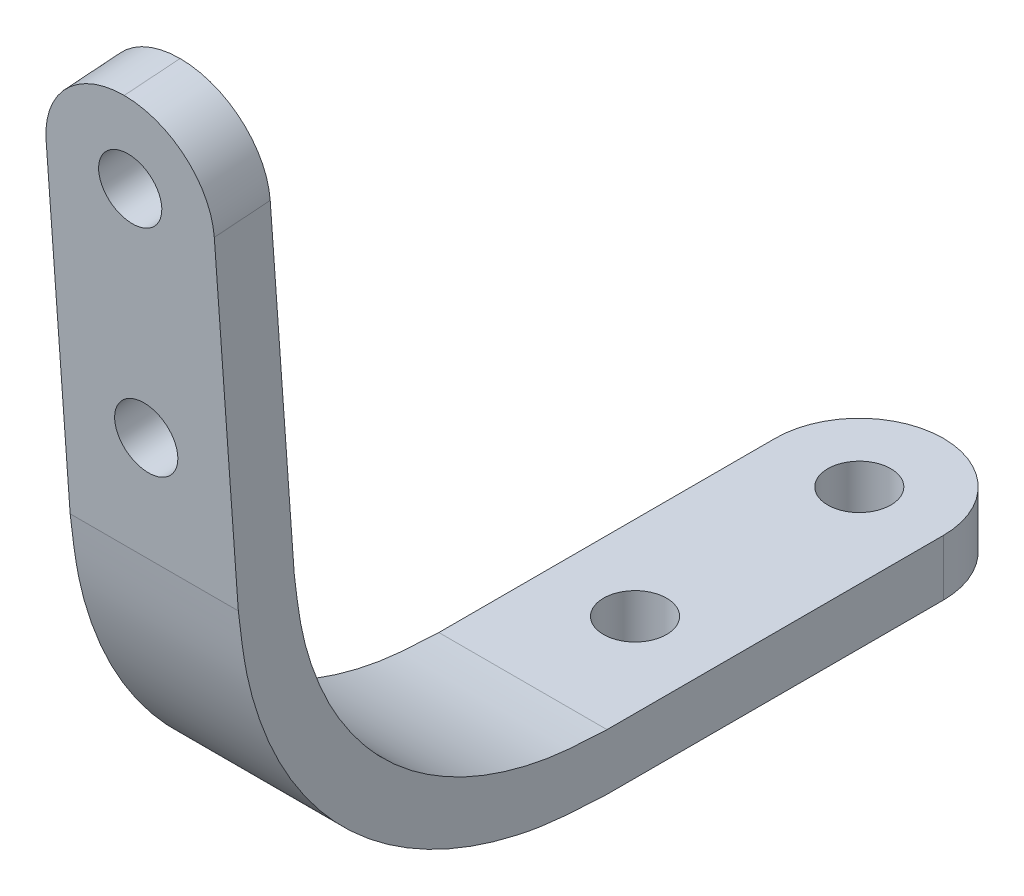
ISO-10303-21;
HEADER;
FILE_DESCRIPTION(('STEP AP214'),'2;1');
FILE_NAME('part.step','',(''),(''),'','','');
FILE_SCHEMA(('AUTOMOTIVE_DESIGN { 1 0 10303 214 1 1 1 1 }'));
ENDSEC;
DATA;
#1=APPLICATION_CONTEXT('core data for automotive mechanical design processes');
#2=APPLICATION_PROTOCOL_DEFINITION('international standard','automotive_design',2000,#1);
#3=PRODUCT_CONTEXT('',#1,'mechanical');
#4=PRODUCT('Part','Part','',(#3));
#5=PRODUCT_RELATED_PRODUCT_CATEGORY('part','',(#4));
#6=PRODUCT_DEFINITION_FORMATION('','',#4);
#7=PRODUCT_DEFINITION_CONTEXT('part definition',#1,'design');
#8=PRODUCT_DEFINITION('design','',#6,#7);
#9=PRODUCT_DEFINITION_SHAPE('','',#8);
#10=(LENGTH_UNIT() NAMED_UNIT(*) SI_UNIT(.MILLI.,.METRE.));
#11=(NAMED_UNIT(*) PLANE_ANGLE_UNIT() SI_UNIT($,.RADIAN.));
#12=(NAMED_UNIT(*) SI_UNIT($,.STERADIAN.) SOLID_ANGLE_UNIT());
#13=UNCERTAINTY_MEASURE_WITH_UNIT(LENGTH_MEASURE(1.E-05),#10,'distance_accuracy_value','');
#14=(GEOMETRIC_REPRESENTATION_CONTEXT(3) GLOBAL_UNCERTAINTY_ASSIGNED_CONTEXT((#13)) GLOBAL_UNIT_ASSIGNED_CONTEXT((#10,
#11,#12)) REPRESENTATION_CONTEXT('',''));
#15=CARTESIAN_POINT('',(0.,0.,0.));
#16=DIRECTION('',(0.,0.,1.));
#17=DIRECTION('',(1.,0.,0.));
#18=AXIS2_PLACEMENT_3D('',#15,#16,#17);
#19=CARTESIAN_POINT('',(9.52499999999997,153.371663551386,-8.11143140761639));
#20=DIRECTION('',(-1.,0.,0.));
#21=DIRECTION('',(0.,-1.,0.));
#22=AXIS2_PLACEMENT_3D('',#19,#20,#21);
#23=PLANE('',#22);
#24=DIRECTION('',(0.,-0.997443763229319,-0.0714558548681243));
#25=VECTOR('',#24,1.);
#26=CARTESIAN_POINT('',(9.52499999999997,153.371663551386,-8.11143140761639));
#27=LINE('',#26,#25);
#28=CARTESIAN_POINT('',(9.52499999999998,90.0339845863243,-12.6488781917423));
#29=VERTEX_POINT('',#28);
#30=CARTESIAN_POINT('',(9.52499999999999,52.0313772072872,-15.3713462622178));
#31=VERTEX_POINT('',#30);
#32=EDGE_CURVE('E917',#29,#31,#27,.T.);
#33=ORIENTED_EDGE('',*,*,#32,.F.);
#34=DIRECTION('',(0.,-0.0714558548681243,0.997443763229319));
#35=VECTOR('',#34,1.);
#36=CARTESIAN_POINT('',(9.52499999999998,90.0339845863243,-12.6488781917423));
#37=LINE('',#36,#35);
#38=CARTESIAN_POINT('',(9.52499999999998,89.5802399079117,-6.31511029523611));
#39=VERTEX_POINT('',#38);
#40=EDGE_CURVE('E13',#29,#39,#37,.T.);
#41=ORIENTED_EDGE('',*,*,#40,.T.);
#42=DIRECTION('',(0.,-0.997443763229319,-0.0714558548681243));
#43=VECTOR('',#42,1.);
#44=CARTESIAN_POINT('',(9.52499999999997,152.917918872973,-1.77766351111022));
#45=LINE('',#44,#43);
#46=CARTESIAN_POINT('',(9.52499999999999,51.5776325288746,-9.03757836571165));
#47=VERTEX_POINT('',#46);
#48=EDGE_CURVE('E933',#39,#47,#45,.T.);
#49=ORIENTED_EDGE('',*,*,#48,.T.);
#50=CARTESIAN_POINT('',(9.525,12.7,-50.8));
#51=CARTESIAN_POINT('',(9.52499999999999,12.8308882748088,-47.8775766786025));
#52=CARTESIAN_POINT('',(9.52499999999998,12.9680178897238,-44.815799103282));
#53=CARTESIAN_POINT('',(9.52500000000002,14.0795826437984,-39.058308853873));
#54=CARTESIAN_POINT('',(9.525,15.0045086451964,-35.9326922808977));
#55=CARTESIAN_POINT('',(9.525,17.2763267557502,-30.6281834819957));
#56=CARTESIAN_POINT('',(9.52499999999999,18.9550405356031,-27.6552517593565));
#57=CARTESIAN_POINT('',(9.52500000000001,22.2956456048244,-23.1021556507154));
#58=CARTESIAN_POINT('',(9.52499999999998,24.6362554487932,-20.5878684088171));
#59=CARTESIAN_POINT('',(9.52500000000001,28.9390069090945,-16.9304573711658));
#60=CARTESIAN_POINT('',(9.52499999999999,31.7843850945897,-15.0436014175862));
#61=CARTESIAN_POINT('',(9.525,36.9129978803806,-12.398553342071));
#62=CARTESIAN_POINT('',(9.52499999999996,39.9645297973123,-11.2526480208772));
#63=CARTESIAN_POINT('',(9.52500000000002,45.6278760286689,-9.73251655946219));
#64=CARTESIAN_POINT('',(9.52500000000001,48.672030222299,-9.37695595513388));
#65=CARTESIAN_POINT('',(9.52499999999999,51.5776325288746,-9.03757836571165));
#66=B_SPLINE_CURVE_WITH_KNOTS('',3,(#50,#51,#52,#53,#54,#55,#56,#57,#58,#59,#60,#61,#62,#63,#64,
#65),.UNSPECIFIED.,.F.,.F.,(4,1,1,1,1,1,1,1,1,1,1,1,1,4),(0.,0.14002984723678,0.146707098525374,
0.280001513089577,0.293357714059953,0.420004816091902,0.440027031922265,0.559972963766613,
0.579995179146985,0.706642278007628,0.719998478792354,0.853292801368042,0.859970045003551,1.),.UNSPECIFIED.);
#67=CARTESIAN_POINT('',(9.525,12.7,-50.8));
#68=VERTEX_POINT('',#67);
#69=EDGE_CURVE('E759',#68,#47,#66,.T.);
#70=ORIENTED_EDGE('',*,*,#69,.F.);
#71=DIRECTION('',(0.,0.,-1.));
#72=VECTOR('',#71,1.);
#73=CARTESIAN_POINT('',(9.525,12.7,0.));
#74=LINE('',#73,#72);
#75=CARTESIAN_POINT('',(9.525,12.7,-88.9));
#76=VERTEX_POINT('',#75);
#77=EDGE_CURVE('E738',#68,#76,#74,.T.);
#78=ORIENTED_EDGE('',*,*,#77,.T.);
#79=DIRECTION('',(0.,-1.,0.));
#80=VECTOR('',#79,1.);
#81=CARTESIAN_POINT('',(9.525,19.05,-88.9));
#82=LINE('',#81,#80);
#83=CARTESIAN_POINT('',(9.525,19.05,-88.9));
#84=VERTEX_POINT('',#83);
#85=EDGE_CURVE('E842',#76,#84,#82,.F.);
#86=ORIENTED_EDGE('',*,*,#85,.T.);
#87=DIRECTION('',(0.,0.,-1.));
#88=VECTOR('',#87,1.);
#89=CARTESIAN_POINT('',(9.525,19.05,0.));
#90=LINE('',#89,#88);
#91=CARTESIAN_POINT('',(9.525,19.05,-50.8));
#92=VERTEX_POINT('',#91);
#93=EDGE_CURVE('E737',#92,#84,#90,.T.);
#94=ORIENTED_EDGE('',*,*,#93,.F.);
#95=CARTESIAN_POINT('',(9.525,19.05,-50.8));
#96=CARTESIAN_POINT('',(9.525,19.164352680165,-48.2597212592029));
#97=CARTESIAN_POINT('',(9.52500000000001,19.2841582091051,-45.5983106323823));
#98=CARTESIAN_POINT('',(9.52499999999999,20.2385827079795,-40.6556094477857));
#99=CARTESIAN_POINT('',(9.525,21.0248239240138,-38.0053834579985));
#100=CARTESIAN_POINT('',(9.525,22.9396422864231,-33.5343931314013));
#101=CARTESIAN_POINT('',(9.525,24.3535138465138,-31.0320223661287));
#102=CARTESIAN_POINT('',(9.52499999999999,27.1498113937403,-27.2213574601229));
#103=CARTESIAN_POINT('',(9.525,29.0917861926064,-25.1352846926192));
#104=CARTESIAN_POINT('',(9.52499999999999,32.692898237172,-22.0738408589274));
#105=CARTESIAN_POINT('',(9.52499999999999,35.0878428901997,-20.4847744600066));
#106=CARTESIAN_POINT('',(9.525,39.4105777776866,-18.2553732148253));
#107=CARTESIAN_POINT('',(9.52499999999998,41.9978464754054,-17.2817669629771));
#108=CARTESIAN_POINT('',(9.52500000000001,46.8597120958185,-15.9765965029822));
#109=CARTESIAN_POINT('',(9.525,49.505760894048,-15.6669241561299));
#110=CARTESIAN_POINT('',(9.52499999999999,52.0313772072872,-15.3713462622178));
#111=B_SPLINE_CURVE_WITH_KNOTS('',3,(#95,#96,#97,#98,#99,#100,#101,#102,#103,#104,#105,#106,
#107,#108,#109,#110),.UNSPECIFIED.,.F.,.F.,(4,1,1,1,1,1,1,1,1,1,1,1,1,4),(0.,0.14002984723678,
0.146707098525374,0.280001513089577,0.293357714059953,0.420004816091902,0.440027031922265,
0.559972963766613,0.579995179146985,0.706642278007628,0.719998478792354,0.853292801368042,
0.859970045003551,1.),.UNSPECIFIED.);
#112=EDGE_CURVE('E747',#31,#92,#111,.F.);
#113=ORIENTED_EDGE('',*,*,#112,.F.);
#114=EDGE_LOOP('',(#33,#41,#49,#70,#78,#86,#94,#113));
#115=FACE_BOUND('',#114,.T.);
#116=ADVANCED_FACE('F649',(#115),#23,.F.);
#117=CARTESIAN_POINT('',(-9.52500000000001,1.36123403523777,-19.0013036895185));
#118=DIRECTION('',(1.,0.,0.));
#119=DIRECTION('',(0.,1.,0.));
#120=AXIS2_PLACEMENT_3D('',#117,#118,#119);
#121=PLANE('',#120);
#122=DIRECTION('',(0.,0.997443763229319,0.0714558548681243));
#123=VECTOR('',#122,1.);
#124=CARTESIAN_POINT('',(-9.52500000000001,0.907489356825177,-12.6675357930124));
#125=LINE('',#124,#123);
#126=CARTESIAN_POINT('',(-9.52500000000002,51.5776325288746,-9.03757836571164));
#127=VERTEX_POINT('',#126);
#128=CARTESIAN_POINT('',(-9.52500000000003,89.5802399079117,-6.31511029523611));
#129=VERTEX_POINT('',#128);
#130=EDGE_CURVE('E913',#127,#129,#125,.T.);
#131=ORIENTED_EDGE('',*,*,#130,.T.);
#132=DIRECTION('',(0.,-0.0714558548681243,0.997443763229319));
#133=VECTOR('',#132,1.);
#134=CARTESIAN_POINT('',(-9.52500000000003,90.0339845863243,-12.6488781917423));
#135=LINE('',#134,#133);
#136=CARTESIAN_POINT('',(-9.52500000000003,90.0339845863243,-12.6488781917423));
#137=VERTEX_POINT('',#136);
#138=EDGE_CURVE('E915',#129,#137,#135,.F.);
#139=ORIENTED_EDGE('',*,*,#138,.T.);
#140=DIRECTION('',(0.,0.997443763229319,0.0714558548681243));
#141=VECTOR('',#140,1.);
#142=CARTESIAN_POINT('',(-9.52500000000001,1.36123403523777,-19.0013036895185));
#143=LINE('',#142,#141);
#144=CARTESIAN_POINT('',(-9.52500000000002,52.0313772072872,-15.3713462622178));
#145=VERTEX_POINT('',#144);
#146=EDGE_CURVE('E755',#145,#137,#143,.T.);
#147=ORIENTED_EDGE('',*,*,#146,.F.);
#148=CARTESIAN_POINT('',(-9.525,19.05,-50.8));
#149=CARTESIAN_POINT('',(-9.52500000000001,19.164352680165,-48.2597212592029));
#150=CARTESIAN_POINT('',(-9.52500000000002,19.2841582091051,-45.5983106323823));
#151=CARTESIAN_POINT('',(-9.52499999999999,20.2385827079795,-40.6556094477857));
#152=CARTESIAN_POINT('',(-9.52500000000001,21.0248239240138,-38.0053834579985));
#153=CARTESIAN_POINT('',(-9.525,22.9396422864231,-33.5343931314013));
#154=CARTESIAN_POINT('',(-9.525,24.3535138465138,-31.0320223661287));
#155=CARTESIAN_POINT('',(-9.52500000000001,27.1498113937403,-27.2213574601229));
#156=CARTESIAN_POINT('',(-9.52500000000002,29.0917861926064,-25.1352846926192));
#157=CARTESIAN_POINT('',(-9.52500000000001,32.692898237172,-22.0738408589274));
#158=CARTESIAN_POINT('',(-9.52500000000001,35.0878428901997,-20.4847744600066));
#159=CARTESIAN_POINT('',(-9.52500000000003,39.4105777776866,-18.2553732148253));
#160=CARTESIAN_POINT('',(-9.52500000000001,41.9978464754054,-17.281766962977));
#161=CARTESIAN_POINT('',(-9.52500000000004,46.8597120958185,-15.9765965029822));
#162=CARTESIAN_POINT('',(-9.52500000000003,49.505760894048,-15.6669241561299));
#163=CARTESIAN_POINT('',(-9.52500000000002,52.0313772072872,-15.3713462622178));
#164=B_SPLINE_CURVE_WITH_KNOTS('',3,(#148,#149,#150,#151,#152,#153,#154,#155,#156,#157,#158,
#159,#160,#161,#162,#163),.UNSPECIFIED.,.F.,.F.,(4,1,1,1,1,1,1,1,1,1,1,1,1,4),(0.,
0.14002984723678,0.146707098525374,0.280001513089577,0.293357714059953,0.420004816091902,
0.440027031922265,0.559972963766613,0.579995179146985,0.706642278007628,0.719998478792354,
0.853292801368042,0.859970045003551,1.),.UNSPECIFIED.);
#165=CARTESIAN_POINT('',(-9.525,19.05,-50.8));
#166=VERTEX_POINT('',#165);
#167=EDGE_CURVE('E745',#166,#145,#164,.T.);
#168=ORIENTED_EDGE('',*,*,#167,.F.);
#169=DIRECTION('',(0.,0.,1.));
#170=VECTOR('',#169,1.);
#171=CARTESIAN_POINT('',(-9.525,19.05,-152.4));
#172=LINE('',#171,#170);
#173=CARTESIAN_POINT('',(-9.525,19.05,-88.9));
#174=VERTEX_POINT('',#173);
#175=EDGE_CURVE('E725',#174,#166,#172,.T.);
#176=ORIENTED_EDGE('',*,*,#175,.F.);
#177=DIRECTION('',(0.,-1.,0.));
#178=VECTOR('',#177,1.);
#179=CARTESIAN_POINT('',(-9.525,19.05,-88.9));
#180=LINE('',#179,#178);
#181=CARTESIAN_POINT('',(-9.525,12.7,-88.9));
#182=VERTEX_POINT('',#181);
#183=EDGE_CURVE('E897',#174,#182,#180,.T.);
#184=ORIENTED_EDGE('',*,*,#183,.T.);
#185=DIRECTION('',(0.,0.,1.));
#186=VECTOR('',#185,1.);
#187=CARTESIAN_POINT('',(-9.525,12.7,-152.4));
#188=LINE('',#187,#186);
#189=CARTESIAN_POINT('',(-9.525,12.7,-50.8));
#190=VERTEX_POINT('',#189);
#191=EDGE_CURVE('E874',#182,#190,#188,.T.);
#192=ORIENTED_EDGE('',*,*,#191,.T.);
#193=CARTESIAN_POINT('',(-9.525,12.7,-50.8));
#194=CARTESIAN_POINT('',(-9.52500000000001,12.8308882748088,-47.8775766786025));
#195=CARTESIAN_POINT('',(-9.52500000000001,12.9680178897238,-44.815799103282));
#196=CARTESIAN_POINT('',(-9.52499999999999,14.0795826437984,-39.058308853873));
#197=CARTESIAN_POINT('',(-9.52500000000001,15.0045086451964,-35.9326922808976));
#198=CARTESIAN_POINT('',(-9.525,17.2763267557502,-30.6281834819958));
#199=CARTESIAN_POINT('',(-9.525,18.9550405356031,-27.6552517593565));
#200=CARTESIAN_POINT('',(-9.52500000000001,22.2956456048244,-23.1021556507154));
#201=CARTESIAN_POINT('',(-9.52500000000001,24.6362554487932,-20.5878684088171));
#202=CARTESIAN_POINT('',(-9.52500000000001,28.9390069090945,-16.9304573711658));
#203=CARTESIAN_POINT('',(-9.525,31.7843850945897,-15.0436014175862));
#204=CARTESIAN_POINT('',(-9.52500000000003,36.9129978803806,-12.398553342071));
#205=CARTESIAN_POINT('',(-9.52499999999999,39.9645297973123,-11.2526480208772));
#206=CARTESIAN_POINT('',(-9.52500000000005,45.6278760286689,-9.73251655946217));
#207=CARTESIAN_POINT('',(-9.52500000000004,48.672030222299,-9.37695595513387));
#208=CARTESIAN_POINT('',(-9.52500000000002,51.5776325288746,-9.03757836571164));
#209=B_SPLINE_CURVE_WITH_KNOTS('',3,(#193,#194,#195,#196,#197,#198,#199,#200,#201,#202,#203,
#204,#205,#206,#207,#208),.UNSPECIFIED.,.F.,.F.,(4,1,1,1,1,1,1,1,1,1,1,1,1,4),(0.,
0.14002984723678,0.146707098525374,0.280001513089577,0.293357714059953,0.420004816091902,
0.440027031922265,0.559972963766613,0.579995179146985,0.706642278007628,0.719998478792354,
0.853292801368042,0.859970045003551,1.),.UNSPECIFIED.);
#210=EDGE_CURVE('E756',#190,#127,#209,.T.);
#211=ORIENTED_EDGE('',*,*,#210,.T.);
#212=EDGE_LOOP('',(#131,#139,#147,#168,#176,#184,#192,#211));
#213=FACE_BOUND('',#212,.T.);
#214=ADVANCED_FACE('F753',(#213),#121,.F.);
#215=CARTESIAN_POINT('',(0.,1.36123403523777,-19.0013036895185));
#216=DIRECTION('',(0.,0.0714558548681243,-0.997443763229319));
#217=DIRECTION('',(0.,0.997443763229319,0.0714558548681243));
#218=AXIS2_PLACEMENT_3D('',#215,#216,#217);
#219=PLANE('',#218);
#220=CARTESIAN_POINT('',(0.,90.0339845863243,-12.6488781917423));
#221=DIRECTION('',(0.,0.0714558548681243,-0.997443763229319));
#222=DIRECTION('',(0.,0.997443763229319,0.0714558548681243));
#223=AXIS2_PLACEMENT_3D('',#220,#221,#222);
#224=CIRCLE('',#223,3.57124);
#225=CARTESIAN_POINT('',(0.,93.5960956513193,-12.393692184603));
#226=VERTEX_POINT('',#225);
#227=EDGE_CURVE('E941',#226,#226,#224,.T.);
#228=ORIENTED_EDGE('',*,*,#227,.F.);
#229=EDGE_LOOP('',(#228));
#230=FACE_BOUND('',#229,.T.);
#231=CARTESIAN_POINT('',(0.,64.6989130002996,-14.4638569053926));
#232=DIRECTION('',(0.,0.0714558548681243,-0.997443763229319));
#233=DIRECTION('',(0.,0.997443763229319,0.0714558548681243));
#234=AXIS2_PLACEMENT_3D('',#231,#232,#233);
#235=CIRCLE('',#234,3.57124);
#236=CARTESIAN_POINT('',(0.,68.2610240652946,-14.2086708982534));
#237=VERTEX_POINT('',#236);
#238=EDGE_CURVE('E937',#237,#237,#235,.T.);
#239=ORIENTED_EDGE('',*,*,#238,.F.);
#240=EDGE_LOOP('',(#239));
#241=FACE_BOUND('',#240,.T.);
#242=ORIENTED_EDGE('',*,*,#146,.T.);
#243=CARTESIAN_POINT('',(0.,90.0339845863243,-12.6488781917423));
#244=DIRECTION('',(0.,0.0714558548681243,-0.997443763229319));
#245=DIRECTION('',(0.,0.997443763229319,0.0714558548681243));
#246=AXIS2_PLACEMENT_3D('',#243,#244,#245);
#247=CIRCLE('',#246,9.525);
#248=CARTESIAN_POINT('',(0.,99.5346364310835,-11.9682611741234));
#249=VERTEX_POINT('',#248);
#250=EDGE_CURVE('E659',#137,#249,#247,.T.);
#251=ORIENTED_EDGE('',*,*,#250,.T.);
#252=CARTESIAN_POINT('',(0.,90.0339845863243,-12.6488781917423));
#253=DIRECTION('',(0.,0.0714558548681243,-0.997443763229319));
#254=DIRECTION('',(0.,0.997443763229319,0.0714558548681243));
#255=AXIS2_PLACEMENT_3D('',#252,#253,#254);
#256=CIRCLE('',#255,9.525);
#257=EDGE_CURVE('E670',#249,#29,#256,.T.);
#258=ORIENTED_EDGE('',*,*,#257,.T.);
#259=ORIENTED_EDGE('',*,*,#32,.T.);
#260=CARTESIAN_POINT('',(-9.52500000000002,52.0313772072872,-15.3713462622178));
#261=CARTESIAN_POINT('',(9.52499999999999,52.0313772072872,-15.3713462622178));
#262=B_SPLINE_CURVE_WITH_KNOTS('',1,(#260,#261),.UNSPECIFIED.,.F.,.F.,(2,2),(0.,1.),.UNSPECIFIED.);
#263=EDGE_CURVE('E828',#31,#145,#262,.F.);
#264=ORIENTED_EDGE('',*,*,#263,.T.);
#265=EDGE_LOOP('',(#242,#251,#258,#259,#264));
#266=FACE_BOUND('',#265,.T.);
#267=ADVANCED_FACE('F955',(#230,#241,#266),#219,.T.);
#268=CARTESIAN_POINT('',(0.,0.907489356825179,-12.6675357930124));
#269=DIRECTION('',(0.,0.0714558548681243,-0.997443763229319));
#270=DIRECTION('',(0.,0.997443763229319,0.0714558548681243));
#271=AXIS2_PLACEMENT_3D('',#268,#269,#270);
#272=PLANE('',#271);
#273=CARTESIAN_POINT('',(0.,89.5802399079117,-6.31511029523611));
#274=DIRECTION('',(0.,0.0714558548681243,-0.997443763229319));
#275=DIRECTION('',(0.,0.997443763229319,0.0714558548681243));
#276=AXIS2_PLACEMENT_3D('',#273,#274,#275);
#277=CIRCLE('',#276,3.57124);
#278=CARTESIAN_POINT('',(0.,93.1423509729068,-6.05992428809687));
#279=VERTEX_POINT('',#278);
#280=EDGE_CURVE('E938',#279,#279,#277,.T.);
#281=ORIENTED_EDGE('',*,*,#280,.T.);
#282=EDGE_LOOP('',(#281));
#283=FACE_BOUND('',#282,.T.);
#284=CARTESIAN_POINT('',(0.,64.245168321887,-8.13008900888646));
#285=DIRECTION('',(0.,0.0714558548681243,-0.997443763229319));
#286=DIRECTION('',(0.,0.997443763229319,0.0714558548681243));
#287=AXIS2_PLACEMENT_3D('',#284,#285,#286);
#288=CIRCLE('',#287,3.57124);
#289=CARTESIAN_POINT('',(0.,67.8072793868821,-7.87490300174722));
#290=VERTEX_POINT('',#289);
#291=EDGE_CURVE('E934',#290,#290,#288,.T.);
#292=ORIENTED_EDGE('',*,*,#291,.T.);
#293=EDGE_LOOP('',(#292));
#294=FACE_BOUND('',#293,.T.);
#295=CARTESIAN_POINT('',(0.,89.5802399079117,-6.31511029523611));
#296=DIRECTION('',(0.,0.0714558548681243,-0.997443763229319));
#297=DIRECTION('',(0.,0.997443763229319,0.0714558548681243));
#298=AXIS2_PLACEMENT_3D('',#295,#296,#297);
#299=CIRCLE('',#298,9.525);
#300=CARTESIAN_POINT('',(0.,99.080891752671,-5.63449327761722));
#301=VERTEX_POINT('',#300);
#302=EDGE_CURVE('E926',#39,#301,#299,.F.);
#303=ORIENTED_EDGE('',*,*,#302,.T.);
#304=CARTESIAN_POINT('',(0.,89.5802399079117,-6.31511029523611));
#305=DIRECTION('',(0.,0.0714558548681243,-0.997443763229319));
#306=DIRECTION('',(0.,0.997443763229319,0.0714558548681243));
#307=AXIS2_PLACEMENT_3D('',#304,#305,#306);
#308=CIRCLE('',#307,9.525);
#309=EDGE_CURVE('E923',#301,#129,#308,.F.);
#310=ORIENTED_EDGE('',*,*,#309,.T.);
#311=ORIENTED_EDGE('',*,*,#130,.F.);
#312=CARTESIAN_POINT('',(9.52499999999999,51.5776325288746,-9.03757836571165));
#313=CARTESIAN_POINT('',(-9.52500000000002,51.5776325288746,-9.03757836571164));
#314=B_SPLINE_CURVE_WITH_KNOTS('',1,(#312,#313),.UNSPECIFIED.,.F.,.F.,(2,2),(0.,1.),.UNSPECIFIED.);
#315=EDGE_CURVE('E912',#47,#127,#314,.T.);
#316=ORIENTED_EDGE('',*,*,#315,.F.);
#317=ORIENTED_EDGE('',*,*,#48,.F.);
#318=EDGE_LOOP('',(#303,#310,#311,#316,#317));
#319=FACE_BOUND('',#318,.T.);
#320=ADVANCED_FACE('F964',(#283,#294,#319),#272,.F.);
#321=CARTESIAN_POINT('',(0.,90.0339845863243,-12.6488781917423));
#322=DIRECTION('',(0.,-0.0714558548681243,0.997443763229319));
#323=DIRECTION('',(0.,-0.997443763229319,-0.0714558548681243));
#324=AXIS2_PLACEMENT_3D('',#321,#322,#323);
#325=CYLINDRICAL_SURFACE('',#324,9.525);
#326=ORIENTED_EDGE('',*,*,#40,.F.);
#327=ORIENTED_EDGE('',*,*,#257,.F.);
#328=DIRECTION('',(0.,-0.0714558548681243,0.997443763229319));
#329=VECTOR('',#328,1.);
#330=CARTESIAN_POINT('',(0.,99.5346364310835,-11.9682611741234));
#331=LINE('',#330,#329);
#332=EDGE_CURVE('E931',#301,#249,#331,.F.);
#333=ORIENTED_EDGE('',*,*,#332,.F.);
#334=ORIENTED_EDGE('',*,*,#302,.F.);
#335=EDGE_LOOP('',(#326,#327,#333,#334));
#336=FACE_BOUND('',#335,.T.);
#337=ADVANCED_FACE('F651',(#336),#325,.T.);
#338=CARTESIAN_POINT('',(0.,90.0339845863243,-12.6488781917423));
#339=DIRECTION('',(0.,-0.0714558548681243,0.997443763229319));
#340=DIRECTION('',(0.,-0.997443763229319,-0.0714558548681243));
#341=AXIS2_PLACEMENT_3D('',#338,#339,#340);
#342=CYLINDRICAL_SURFACE('',#341,9.525);
#343=ORIENTED_EDGE('',*,*,#250,.F.);
#344=ORIENTED_EDGE('',*,*,#138,.F.);
#345=ORIENTED_EDGE('',*,*,#309,.F.);
#346=ORIENTED_EDGE('',*,*,#332,.T.);
#347=EDGE_LOOP('',(#343,#344,#345,#346));
#348=FACE_BOUND('',#347,.T.);
#349=ADVANCED_FACE('F921',(#348),#342,.T.);
#350=CARTESIAN_POINT('',(0.,64.6989130002996,-14.4638569053926));
#351=DIRECTION('',(0.,0.0714558548681243,-0.997443763229319));
#352=DIRECTION('',(0.,0.997443763229319,0.0714558548681243));
#353=AXIS2_PLACEMENT_3D('',#350,#351,#352);
#354=CYLINDRICAL_SURFACE('',#353,3.57124);
#355=ORIENTED_EDGE('',*,*,#238,.T.);
#356=EDGE_LOOP('',(#355));
#357=FACE_BOUND('',#356,.T.);
#358=ORIENTED_EDGE('',*,*,#291,.F.);
#359=EDGE_LOOP('',(#358));
#360=FACE_BOUND('',#359,.T.);
#361=ADVANCED_FACE('F966',(#357,#360),#354,.F.);
#362=CARTESIAN_POINT('',(0.,90.0339845863243,-12.6488781917423));
#363=DIRECTION('',(0.,0.0714558548681243,-0.997443763229319));
#364=DIRECTION('',(0.,0.997443763229319,0.0714558548681243));
#365=AXIS2_PLACEMENT_3D('',#362,#363,#364);
#366=CYLINDRICAL_SURFACE('',#365,3.57124);
#367=ORIENTED_EDGE('',*,*,#227,.T.);
#368=EDGE_LOOP('',(#367));
#369=FACE_BOUND('',#368,.T.);
#370=ORIENTED_EDGE('',*,*,#280,.F.);
#371=EDGE_LOOP('',(#370));
#372=FACE_BOUND('',#371,.T.);
#373=ADVANCED_FACE('F808',(#369,#372),#366,.F.);
#374=CARTESIAN_POINT('',(9.525,19.05,-50.8));
#375=CARTESIAN_POINT('',(9.525,19.164352680165,-48.2597212592029));
#376=CARTESIAN_POINT('',(9.52500000000001,19.2841582091051,-45.5983106323823));
#377=CARTESIAN_POINT('',(9.52499999999999,20.2385827079795,-40.6556094477857));
#378=CARTESIAN_POINT('',(9.525,21.0248239240138,-38.0053834579985));
#379=CARTESIAN_POINT('',(9.525,22.9396422864231,-33.5343931314013));
#380=CARTESIAN_POINT('',(9.525,24.3535138465138,-31.0320223661287));
#381=CARTESIAN_POINT('',(9.52499999999999,27.1498113937403,-27.2213574601229));
#382=CARTESIAN_POINT('',(9.525,29.0917861926064,-25.1352846926192));
#383=CARTESIAN_POINT('',(9.52499999999999,32.692898237172,-22.0738408589274));
#384=CARTESIAN_POINT('',(9.52499999999999,35.0878428901997,-20.4847744600066));
#385=CARTESIAN_POINT('',(9.525,39.4105777776866,-18.2553732148253));
#386=CARTESIAN_POINT('',(9.52499999999998,41.9978464754054,-17.2817669629771));
#387=CARTESIAN_POINT('',(9.52500000000001,46.8597120958185,-15.9765965029822));
#388=CARTESIAN_POINT('',(9.525,49.505760894048,-15.6669241561299));
#389=CARTESIAN_POINT('',(9.52499999999999,52.0313772072872,-15.3713462622178));
#390=CARTESIAN_POINT('',(-9.525,19.05,-50.8));
#391=CARTESIAN_POINT('',(-9.52500000000001,19.164352680165,-48.2597212592029));
#392=CARTESIAN_POINT('',(-9.52500000000002,19.2841582091051,-45.5983106323823));
#393=CARTESIAN_POINT('',(-9.52499999999999,20.2385827079795,-40.6556094477857));
#394=CARTESIAN_POINT('',(-9.52500000000001,21.0248239240138,-38.0053834579985));
#395=CARTESIAN_POINT('',(-9.525,22.9396422864231,-33.5343931314013));
#396=CARTESIAN_POINT('',(-9.525,24.3535138465138,-31.0320223661287));
#397=CARTESIAN_POINT('',(-9.52500000000001,27.1498113937403,-27.2213574601229));
#398=CARTESIAN_POINT('',(-9.52500000000002,29.0917861926064,-25.1352846926192));
#399=CARTESIAN_POINT('',(-9.52500000000001,32.692898237172,-22.0738408589274));
#400=CARTESIAN_POINT('',(-9.52500000000001,35.0878428901997,-20.4847744600066));
#401=CARTESIAN_POINT('',(-9.52500000000003,39.4105777776866,-18.2553732148253));
#402=CARTESIAN_POINT('',(-9.52500000000001,41.9978464754054,-17.281766962977));
#403=CARTESIAN_POINT('',(-9.52500000000004,46.8597120958185,-15.9765965029822));
#404=CARTESIAN_POINT('',(-9.52500000000003,49.505760894048,-15.6669241561299));
#405=CARTESIAN_POINT('',(-9.52500000000002,52.0313772072872,-15.3713462622178));
#406=B_SPLINE_SURFACE_WITH_KNOTS('',1,3,((#374,#375,#376,#377,#378,#379,#380,#381,#382,#383,
#384,#385,#386,#387,#388,#389),(#390,#391,#392,#393,#394,#395,#396,#397,#398,#399,#400,#401,
#402,#403,#404,#405)),.UNSPECIFIED.,.F.,.F.,.F.,(2,2),(4,1,1,1,1,1,1,1,1,1,1,1,1,4),(0.,1.),(0.,
0.14002984723678,0.146707098525374,0.280001513089577,0.293357714059953,0.420004816091902,
0.440027031922265,0.559972963766613,0.579995179146985,0.706642278007628,0.719998478792354,
0.853292801368042,0.859970045003551,1.),.UNSPECIFIED.);
#407=DIRECTION('',(-1.,0.,0.));
#408=VECTOR('',#407,1.);
#409=CARTESIAN_POINT('',(9.525,19.05,-50.8));
#410=LINE('',#409,#408);
#411=EDGE_CURVE('E653',#92,#166,#410,.T.);
#412=ORIENTED_EDGE('',*,*,#411,.T.);
#413=ORIENTED_EDGE('',*,*,#167,.T.);
#414=ORIENTED_EDGE('',*,*,#263,.F.);
#415=ORIENTED_EDGE('',*,*,#112,.T.);
#416=EDGE_LOOP('',(#412,#413,#414,#415));
#417=FACE_BOUND('',#416,.T.);
#418=ADVANCED_FACE('F743',(#417),#406,.T.);
#419=CARTESIAN_POINT('',(-9.525,12.7,-50.8));
#420=CARTESIAN_POINT('',(-9.52500000000001,12.8308882748088,-47.8775766786025));
#421=CARTESIAN_POINT('',(-9.52500000000001,12.9680178897238,-44.8157991032821));
#422=CARTESIAN_POINT('',(-9.52499999999999,14.0795826437984,-39.058308853873));
#423=CARTESIAN_POINT('',(-9.52500000000001,15.0045086451964,-35.9326922808976));
#424=CARTESIAN_POINT('',(-9.525,17.2763267557502,-30.6281834819958));
#425=CARTESIAN_POINT('',(-9.52500000000001,18.9550405356031,-27.6552517593565));
#426=CARTESIAN_POINT('',(-9.52500000000001,22.2956456048244,-23.1021556507154));
#427=CARTESIAN_POINT('',(-9.52500000000001,24.6362554487932,-20.5878684088171));
#428=CARTESIAN_POINT('',(-9.52500000000001,28.9390069090945,-16.9304573711658));
#429=CARTESIAN_POINT('',(-9.525,31.7843850945897,-15.0436014175862));
#430=CARTESIAN_POINT('',(-9.52500000000003,36.9129978803806,-12.398553342071));
#431=CARTESIAN_POINT('',(-9.52499999999999,39.9645297973123,-11.2526480208772));
#432=CARTESIAN_POINT('',(-9.52500000000005,45.6278760286689,-9.73251655946217));
#433=CARTESIAN_POINT('',(-9.52500000000004,48.672030222299,-9.37695595513387));
#434=CARTESIAN_POINT('',(-9.52500000000002,51.5776325288746,-9.03757836571164));
#435=CARTESIAN_POINT('',(9.525,12.7,-50.8));
#436=CARTESIAN_POINT('',(9.52499999999999,12.8308882748088,-47.8775766786025));
#437=CARTESIAN_POINT('',(9.52499999999998,12.9680178897238,-44.815799103282));
#438=CARTESIAN_POINT('',(9.52500000000002,14.0795826437984,-39.058308853873));
#439=CARTESIAN_POINT('',(9.525,15.0045086451964,-35.9326922808977));
#440=CARTESIAN_POINT('',(9.525,17.2763267557502,-30.6281834819957));
#441=CARTESIAN_POINT('',(9.52499999999999,18.9550405356031,-27.6552517593565));
#442=CARTESIAN_POINT('',(9.52500000000001,22.2956456048244,-23.1021556507154));
#443=CARTESIAN_POINT('',(9.52499999999998,24.6362554487932,-20.5878684088171));
#444=CARTESIAN_POINT('',(9.52500000000001,28.9390069090945,-16.9304573711658));
#445=CARTESIAN_POINT('',(9.52499999999999,31.7843850945897,-15.0436014175862));
#446=CARTESIAN_POINT('',(9.525,36.9129978803806,-12.398553342071));
#447=CARTESIAN_POINT('',(9.52499999999996,39.9645297973123,-11.2526480208772));
#448=CARTESIAN_POINT('',(9.52500000000002,45.6278760286689,-9.73251655946219));
#449=CARTESIAN_POINT('',(9.52500000000001,48.672030222299,-9.37695595513388));
#450=CARTESIAN_POINT('',(9.52499999999999,51.5776325288746,-9.03757836571165));
#451=B_SPLINE_SURFACE_WITH_KNOTS('',1,3,((#419,#420,#421,#422,#423,#424,#425,#426,#427,#428,
#429,#430,#431,#432,#433,#434),(#435,#436,#437,#438,#439,#440,#441,#442,#443,#444,#445,#446,
#447,#448,#449,#450)),.UNSPECIFIED.,.F.,.F.,.F.,(2,2),(4,1,1,1,1,1,1,1,1,1,1,1,1,4),(0.,1.),(0.,
0.14002984723678,0.146707098525374,0.280001513089577,0.293357714059953,0.420004816091902,
0.440027031922265,0.559972963766613,0.579995179146985,0.706642278007628,0.719998478792354,
0.853292801368042,0.859970045003551,1.),.UNSPECIFIED.);
#452=DIRECTION('',(1.,0.,0.));
#453=VECTOR('',#452,1.);
#454=CARTESIAN_POINT('',(-9.525,12.7,-50.8));
#455=LINE('',#454,#453);
#456=EDGE_CURVE('E748',#190,#68,#455,.T.);
#457=ORIENTED_EDGE('',*,*,#456,.T.);
#458=ORIENTED_EDGE('',*,*,#69,.T.);
#459=ORIENTED_EDGE('',*,*,#315,.T.);
#460=ORIENTED_EDGE('',*,*,#210,.F.);
#461=EDGE_LOOP('',(#457,#458,#459,#460));
#462=FACE_BOUND('',#461,.T.);
#463=ADVANCED_FACE('F792',(#462),#451,.T.);
#464=CARTESIAN_POINT('',(0.,19.05,0.));
#465=DIRECTION('',(0.,1.,0.));
#466=DIRECTION('',(0.,0.,1.));
#467=AXIS2_PLACEMENT_3D('',#464,#465,#466);
#468=PLANE('',#467);
#469=CARTESIAN_POINT('',(0.,19.05,-88.9));
#470=DIRECTION('',(0.,1.,0.));
#471=DIRECTION('',(0.,0.,1.));
#472=AXIS2_PLACEMENT_3D('',#469,#470,#471);
#473=CIRCLE('',#472,3.57123999999999);
#474=CARTESIAN_POINT('',(0.,19.05,-85.32876));
#475=VERTEX_POINT('',#474);
#476=EDGE_CURVE('E1132',#475,#475,#473,.T.);
#477=ORIENTED_EDGE('',*,*,#476,.F.);
#478=EDGE_LOOP('',(#477));
#479=FACE_BOUND('',#478,.T.);
#480=CARTESIAN_POINT('',(0.,19.05,-63.5));
#481=DIRECTION('',(0.,1.,0.));
#482=DIRECTION('',(0.,0.,1.));
#483=AXIS2_PLACEMENT_3D('',#480,#481,#482);
#484=CIRCLE('',#483,3.57123999999999);
#485=CARTESIAN_POINT('',(0.,19.05,-59.92876));
#486=VERTEX_POINT('',#485);
#487=EDGE_CURVE('E888',#486,#486,#484,.T.);
#488=ORIENTED_EDGE('',*,*,#487,.F.);
#489=EDGE_LOOP('',(#488));
#490=FACE_BOUND('',#489,.T.);
#491=CARTESIAN_POINT('',(0.,19.05,-88.9));
#492=DIRECTION('',(0.,1.,0.));
#493=DIRECTION('',(0.,0.,1.));
#494=AXIS2_PLACEMENT_3D('',#491,#492,#493);
#495=CIRCLE('',#494,9.525);
#496=CARTESIAN_POINT('',(0.,19.05,-98.425));
#497=VERTEX_POINT('',#496);
#498=EDGE_CURVE('E903',#84,#497,#495,.T.);
#499=ORIENTED_EDGE('',*,*,#498,.T.);
#500=CARTESIAN_POINT('',(0.,19.05,-88.9));
#501=DIRECTION('',(0.,1.,0.));
#502=DIRECTION('',(0.,0.,1.));
#503=AXIS2_PLACEMENT_3D('',#500,#501,#502);
#504=CIRCLE('',#503,9.525);
#505=EDGE_CURVE('E732',#497,#174,#504,.T.);
#506=ORIENTED_EDGE('',*,*,#505,.T.);
#507=ORIENTED_EDGE('',*,*,#175,.T.);
#508=ORIENTED_EDGE('',*,*,#411,.F.);
#509=ORIENTED_EDGE('',*,*,#93,.T.);
#510=EDGE_LOOP('',(#499,#506,#507,#508,#509));
#511=FACE_BOUND('',#510,.T.);
#512=ADVANCED_FACE('F727',(#479,#490,#511),#468,.T.);
#513=CARTESIAN_POINT('',(0.,12.7,0.));
#514=DIRECTION('',(0.,1.,0.));
#515=DIRECTION('',(0.,0.,1.));
#516=AXIS2_PLACEMENT_3D('',#513,#514,#515);
#517=PLANE('',#516);
#518=CARTESIAN_POINT('',(0.,12.7,-88.9));
#519=DIRECTION('',(0.,1.,0.));
#520=DIRECTION('',(0.,0.,1.));
#521=AXIS2_PLACEMENT_3D('',#518,#519,#520);
#522=CIRCLE('',#521,3.57124);
#523=CARTESIAN_POINT('',(0.,12.7,-85.32876));
#524=VERTEX_POINT('',#523);
#525=EDGE_CURVE('E893',#524,#524,#522,.T.);
#526=ORIENTED_EDGE('',*,*,#525,.T.);
#527=EDGE_LOOP('',(#526));
#528=FACE_BOUND('',#527,.T.);
#529=CARTESIAN_POINT('',(0.,12.7,-63.5));
#530=DIRECTION('',(0.,1.,0.));
#531=DIRECTION('',(0.,0.,1.));
#532=AXIS2_PLACEMENT_3D('',#529,#530,#531);
#533=CIRCLE('',#532,3.57124);
#534=CARTESIAN_POINT('',(0.,12.7,-59.92876));
#535=VERTEX_POINT('',#534);
#536=EDGE_CURVE('E884',#535,#535,#533,.T.);
#537=ORIENTED_EDGE('',*,*,#536,.T.);
#538=EDGE_LOOP('',(#537));
#539=FACE_BOUND('',#538,.T.);
#540=ORIENTED_EDGE('',*,*,#191,.F.);
#541=CARTESIAN_POINT('',(0.,12.7,-88.9));
#542=DIRECTION('',(0.,1.,0.));
#543=DIRECTION('',(0.,0.,1.));
#544=AXIS2_PLACEMENT_3D('',#541,#542,#543);
#545=CIRCLE('',#544,9.525);
#546=CARTESIAN_POINT('',(0.,12.7,-98.425));
#547=VERTEX_POINT('',#546);
#548=EDGE_CURVE('E901',#182,#547,#545,.F.);
#549=ORIENTED_EDGE('',*,*,#548,.T.);
#550=CARTESIAN_POINT('',(0.,12.7,-88.9));
#551=DIRECTION('',(0.,1.,0.));
#552=DIRECTION('',(0.,0.,1.));
#553=AXIS2_PLACEMENT_3D('',#550,#551,#552);
#554=CIRCLE('',#553,9.525);
#555=EDGE_CURVE('E899',#547,#76,#554,.F.);
#556=ORIENTED_EDGE('',*,*,#555,.T.);
#557=ORIENTED_EDGE('',*,*,#77,.F.);
#558=ORIENTED_EDGE('',*,*,#456,.F.);
#559=EDGE_LOOP('',(#540,#549,#556,#557,#558));
#560=FACE_BOUND('',#559,.T.);
#561=ADVANCED_FACE('F859',(#528,#539,#560),#517,.F.);
#562=CARTESIAN_POINT('',(0.,19.05,-88.9));
#563=DIRECTION('',(0.,-1.,0.));
#564=DIRECTION('',(0.,0.,-1.));
#565=AXIS2_PLACEMENT_3D('',#562,#563,#564);
#566=CYLINDRICAL_SURFACE('',#565,9.525);
#567=DIRECTION('',(0.,-1.,0.));
#568=VECTOR('',#567,1.);
#569=CARTESIAN_POINT('',(0.,19.05,-98.425));
#570=LINE('',#569,#568);
#571=EDGE_CURVE('E764',#497,#547,#570,.T.);
#572=ORIENTED_EDGE('',*,*,#571,.F.);
#573=ORIENTED_EDGE('',*,*,#498,.F.);
#574=ORIENTED_EDGE('',*,*,#85,.F.);
#575=ORIENTED_EDGE('',*,*,#555,.F.);
#576=EDGE_LOOP('',(#572,#573,#574,#575));
#577=FACE_BOUND('',#576,.T.);
#578=ADVANCED_FACE('F866',(#577),#566,.T.);
#579=CARTESIAN_POINT('',(0.,19.05,-88.9));
#580=DIRECTION('',(0.,-1.,0.));
#581=DIRECTION('',(0.,0.,-1.));
#582=AXIS2_PLACEMENT_3D('',#579,#580,#581);
#583=CYLINDRICAL_SURFACE('',#582,9.525);
#584=ORIENTED_EDGE('',*,*,#505,.F.);
#585=ORIENTED_EDGE('',*,*,#571,.T.);
#586=ORIENTED_EDGE('',*,*,#548,.F.);
#587=ORIENTED_EDGE('',*,*,#183,.F.);
#588=EDGE_LOOP('',(#584,#585,#586,#587));
#589=FACE_BOUND('',#588,.T.);
#590=ADVANCED_FACE('F868',(#589),#583,.T.);
#591=CARTESIAN_POINT('',(0.,19.05,-63.5));
#592=DIRECTION('',(0.,1.,0.));
#593=DIRECTION('',(0.,0.,1.));
#594=AXIS2_PLACEMENT_3D('',#591,#592,#593);
#595=CYLINDRICAL_SURFACE('',#594,3.57123999999999);
#596=ORIENTED_EDGE('',*,*,#536,.F.);
#597=EDGE_LOOP('',(#596));
#598=FACE_BOUND('',#597,.T.);
#599=ORIENTED_EDGE('',*,*,#487,.T.);
#600=EDGE_LOOP('',(#599));
#601=FACE_BOUND('',#600,.T.);
#602=ADVANCED_FACE('F861',(#598,#601),#595,.F.);
#603=CARTESIAN_POINT('',(0.,19.05,-88.9));
#604=DIRECTION('',(0.,1.,0.));
#605=DIRECTION('',(0.,0.,1.));
#606=AXIS2_PLACEMENT_3D('',#603,#604,#605);
#607=CYLINDRICAL_SURFACE('',#606,3.57123999999999);
#608=ORIENTED_EDGE('',*,*,#525,.F.);
#609=EDGE_LOOP('',(#608));
#610=FACE_BOUND('',#609,.T.);
#611=ORIENTED_EDGE('',*,*,#476,.T.);
#612=EDGE_LOOP('',(#611));
#613=FACE_BOUND('',#612,.T.);
#614=ADVANCED_FACE('F1056',(#610,#613),#607,.F.);
#615=CLOSED_SHELL('',(#116,#214,#267,#320,#337,#349,#361,#373,#418,#463,#512,#561,#578,#590,
#602,#614));
#616=MANIFOLD_SOLID_BREP('B2',#615);
#617=ADVANCED_BREP_SHAPE_REPRESENTATION('',(#18,#616),#14);
#618=SHAPE_DEFINITION_REPRESENTATION(#9,#617);
ENDSEC;
END-ISO-10303-21;
